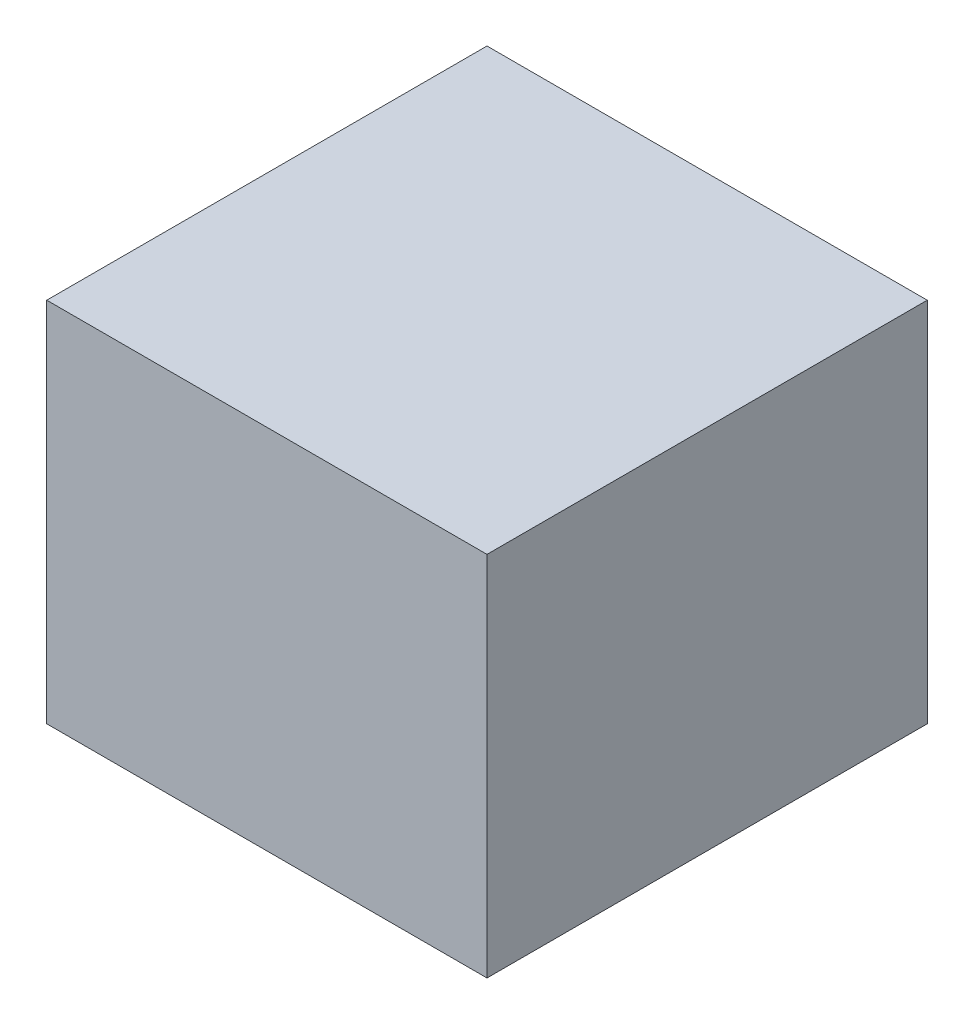
ISO-10303-21;
HEADER;
FILE_DESCRIPTION(('STEP AP214'),'2;1');
FILE_NAME('part.step','',(''),(''),'','','');
FILE_SCHEMA(('AUTOMOTIVE_DESIGN { 1 0 10303 214 1 1 1 1 }'));
ENDSEC;
DATA;
#1=APPLICATION_CONTEXT('core data for automotive mechanical design processes');
#2=APPLICATION_PROTOCOL_DEFINITION('international standard','automotive_design',2000,#1);
#3=PRODUCT_CONTEXT('',#1,'mechanical');
#4=PRODUCT('Part','Part','',(#3));
#5=PRODUCT_RELATED_PRODUCT_CATEGORY('part','',(#4));
#6=PRODUCT_DEFINITION_FORMATION('','',#4);
#7=PRODUCT_DEFINITION_CONTEXT('part definition',#1,'design');
#8=PRODUCT_DEFINITION('design','',#6,#7);
#9=PRODUCT_DEFINITION_SHAPE('','',#8);
#10=(LENGTH_UNIT() NAMED_UNIT(*) SI_UNIT(.MILLI.,.METRE.));
#11=(NAMED_UNIT(*) PLANE_ANGLE_UNIT() SI_UNIT($,.RADIAN.));
#12=(NAMED_UNIT(*) SI_UNIT($,.STERADIAN.) SOLID_ANGLE_UNIT());
#13=UNCERTAINTY_MEASURE_WITH_UNIT(LENGTH_MEASURE(1.E-05),#10,'distance_accuracy_value','');
#14=(GEOMETRIC_REPRESENTATION_CONTEXT(3) GLOBAL_UNCERTAINTY_ASSIGNED_CONTEXT((#13)) GLOBAL_UNIT_ASSIGNED_CONTEXT((#10,
#11,#12)) REPRESENTATION_CONTEXT('',''));
#15=CARTESIAN_POINT('',(0.,0.,0.));
#16=DIRECTION('',(0.,0.,1.));
#17=DIRECTION('',(1.,0.,0.));
#18=AXIS2_PLACEMENT_3D('',#15,#16,#17);
#19=CARTESIAN_POINT('',(-48.,-80.,-48.));
#20=DIRECTION('',(-1.,0.,0.));
#21=DIRECTION('',(0.,0.,1.));
#22=AXIS2_PLACEMENT_3D('',#19,#20,#21);
#23=PLANE('',#22);
#24=DIRECTION('',(0.,0.,1.));
#25=VECTOR('',#24,1.);
#26=CARTESIAN_POINT('',(-48.,0.,-48.));
#27=LINE('',#26,#25);
#28=CARTESIAN_POINT('',(-48.,0.,-48.));
#29=VERTEX_POINT('',#28);
#30=CARTESIAN_POINT('',(-48.,0.,48.));
#31=VERTEX_POINT('',#30);
#32=EDGE_CURVE('E102',#29,#31,#27,.T.);
#33=ORIENTED_EDGE('',*,*,#32,.F.);
#34=DIRECTION('',(0.,1.,0.));
#35=VECTOR('',#34,1.);
#36=CARTESIAN_POINT('',(-48.,-80.,-48.));
#37=LINE('',#36,#35);
#38=CARTESIAN_POINT('',(-48.,-80.,-48.));
#39=VERTEX_POINT('',#38);
#40=EDGE_CURVE('E11',#39,#29,#37,.T.);
#41=ORIENTED_EDGE('',*,*,#40,.F.);
#42=DIRECTION('',(0.,0.,1.));
#43=VECTOR('',#42,1.);
#44=CARTESIAN_POINT('',(-48.,-80.,-48.));
#45=LINE('',#44,#43);
#46=CARTESIAN_POINT('',(-48.,-80.,48.));
#47=VERTEX_POINT('',#46);
#48=EDGE_CURVE('E96',#39,#47,#45,.T.);
#49=ORIENTED_EDGE('',*,*,#48,.T.);
#50=DIRECTION('',(0.,1.,0.));
#51=VECTOR('',#50,1.);
#52=CARTESIAN_POINT('',(-48.,-80.,48.));
#53=LINE('',#52,#51);
#54=EDGE_CURVE('E41',#47,#31,#53,.T.);
#55=ORIENTED_EDGE('',*,*,#54,.T.);
#56=EDGE_LOOP('',(#33,#41,#49,#55));
#57=FACE_BOUND('',#56,.T.);
#58=ADVANCED_FACE('F38',(#57),#23,.T.);
#59=CARTESIAN_POINT('',(-48.,-80.,-48.));
#60=DIRECTION('',(0.,0.,-1.));
#61=DIRECTION('',(-1.,0.,0.));
#62=AXIS2_PLACEMENT_3D('',#59,#60,#61);
#63=PLANE('',#62);
#64=DIRECTION('',(-1.,0.,0.));
#65=VECTOR('',#64,1.);
#66=CARTESIAN_POINT('',(-48.,0.,-48.));
#67=LINE('',#66,#65);
#68=CARTESIAN_POINT('',(48.,0.,-48.));
#69=VERTEX_POINT('',#68);
#70=EDGE_CURVE('E98',#69,#29,#67,.T.);
#71=ORIENTED_EDGE('',*,*,#70,.F.);
#72=DIRECTION('',(0.,1.,0.));
#73=VECTOR('',#72,1.);
#74=CARTESIAN_POINT('',(48.,-80.,-48.));
#75=LINE('',#74,#73);
#76=CARTESIAN_POINT('',(48.,-80.,-48.));
#77=VERTEX_POINT('',#76);
#78=EDGE_CURVE('E47',#77,#69,#75,.T.);
#79=ORIENTED_EDGE('',*,*,#78,.F.);
#80=DIRECTION('',(-1.,0.,0.));
#81=VECTOR('',#80,1.);
#82=CARTESIAN_POINT('',(-48.,-80.,-48.));
#83=LINE('',#82,#81);
#84=EDGE_CURVE('E93',#77,#39,#83,.T.);
#85=ORIENTED_EDGE('',*,*,#84,.T.);
#86=ORIENTED_EDGE('',*,*,#40,.T.);
#87=EDGE_LOOP('',(#71,#79,#85,#86));
#88=FACE_BOUND('',#87,.T.);
#89=ADVANCED_FACE('F112',(#88),#63,.T.);
#90=CARTESIAN_POINT('',(48.,-80.,-48.));
#91=DIRECTION('',(1.,0.,0.));
#92=DIRECTION('',(0.,0.,-1.));
#93=AXIS2_PLACEMENT_3D('',#90,#91,#92);
#94=PLANE('',#93);
#95=DIRECTION('',(0.,0.,-1.));
#96=VECTOR('',#95,1.);
#97=CARTESIAN_POINT('',(48.,0.,-48.));
#98=LINE('',#97,#96);
#99=CARTESIAN_POINT('',(48.,0.,47.9999999999999));
#100=VERTEX_POINT('',#99);
#101=EDGE_CURVE('E88',#100,#69,#98,.T.);
#102=ORIENTED_EDGE('',*,*,#101,.F.);
#103=DIRECTION('',(0.,1.,0.));
#104=VECTOR('',#103,1.);
#105=CARTESIAN_POINT('',(48.,-80.,47.9999999999999));
#106=LINE('',#105,#104);
#107=CARTESIAN_POINT('',(48.,-80.,47.9999999999999));
#108=VERTEX_POINT('',#107);
#109=EDGE_CURVE('E83',#108,#100,#106,.T.);
#110=ORIENTED_EDGE('',*,*,#109,.F.);
#111=DIRECTION('',(0.,0.,-1.));
#112=VECTOR('',#111,1.);
#113=CARTESIAN_POINT('',(48.,-80.,-48.));
#114=LINE('',#113,#112);
#115=EDGE_CURVE('E86',#108,#77,#114,.T.);
#116=ORIENTED_EDGE('',*,*,#115,.T.);
#117=ORIENTED_EDGE('',*,*,#78,.T.);
#118=EDGE_LOOP('',(#102,#110,#116,#117));
#119=FACE_BOUND('',#118,.T.);
#120=ADVANCED_FACE('F85',(#119),#94,.T.);
#121=CARTESIAN_POINT('',(-48.,-80.,48.));
#122=DIRECTION('',(0.,0.,1.));
#123=DIRECTION('',(1.,0.,0.));
#124=AXIS2_PLACEMENT_3D('',#121,#122,#123);
#125=PLANE('',#124);
#126=DIRECTION('',(1.,0.,0.));
#127=VECTOR('',#126,1.);
#128=CARTESIAN_POINT('',(-48.,0.,48.));
#129=LINE('',#128,#127);
#130=EDGE_CURVE('E105',#31,#100,#129,.T.);
#131=ORIENTED_EDGE('',*,*,#130,.F.);
#132=ORIENTED_EDGE('',*,*,#54,.F.);
#133=DIRECTION('',(1.,0.,0.));
#134=VECTOR('',#133,1.);
#135=CARTESIAN_POINT('',(-48.,-80.,48.));
#136=LINE('',#135,#134);
#137=EDGE_CURVE('E92',#47,#108,#136,.T.);
#138=ORIENTED_EDGE('',*,*,#137,.T.);
#139=ORIENTED_EDGE('',*,*,#109,.T.);
#140=EDGE_LOOP('',(#131,#132,#138,#139));
#141=FACE_BOUND('',#140,.T.);
#142=ADVANCED_FACE('F95',(#141),#125,.T.);
#143=CARTESIAN_POINT('',(0.,-80.,0.));
#144=DIRECTION('',(0.,1.,0.));
#145=DIRECTION('',(0.,0.,1.));
#146=AXIS2_PLACEMENT_3D('',#143,#144,#145);
#147=PLANE('',#146);
#148=ORIENTED_EDGE('',*,*,#48,.F.);
#149=ORIENTED_EDGE('',*,*,#84,.F.);
#150=ORIENTED_EDGE('',*,*,#115,.F.);
#151=ORIENTED_EDGE('',*,*,#137,.F.);
#152=EDGE_LOOP('',(#148,#149,#150,#151));
#153=FACE_BOUND('',#152,.T.);
#154=ADVANCED_FACE('F91',(#153),#147,.F.);
#155=CARTESIAN_POINT('',(0.,0.,0.));
#156=DIRECTION('',(0.,1.,0.));
#157=DIRECTION('',(0.,0.,1.));
#158=AXIS2_PLACEMENT_3D('',#155,#156,#157);
#159=PLANE('',#158);
#160=ORIENTED_EDGE('',*,*,#32,.T.);
#161=ORIENTED_EDGE('',*,*,#130,.T.);
#162=ORIENTED_EDGE('',*,*,#101,.T.);
#163=ORIENTED_EDGE('',*,*,#70,.T.);
#164=EDGE_LOOP('',(#160,#161,#162,#163));
#165=FACE_BOUND('',#164,.T.);
#166=ADVANCED_FACE('F111',(#165),#159,.T.);
#167=CLOSED_SHELL('',(#58,#89,#120,#142,#154,#166));
#168=MANIFOLD_SOLID_BREP('B2',#167);
#169=ADVANCED_BREP_SHAPE_REPRESENTATION('',(#18,#168),#14);
#170=SHAPE_DEFINITION_REPRESENTATION(#9,#169);
ENDSEC;
END-ISO-10303-21;
